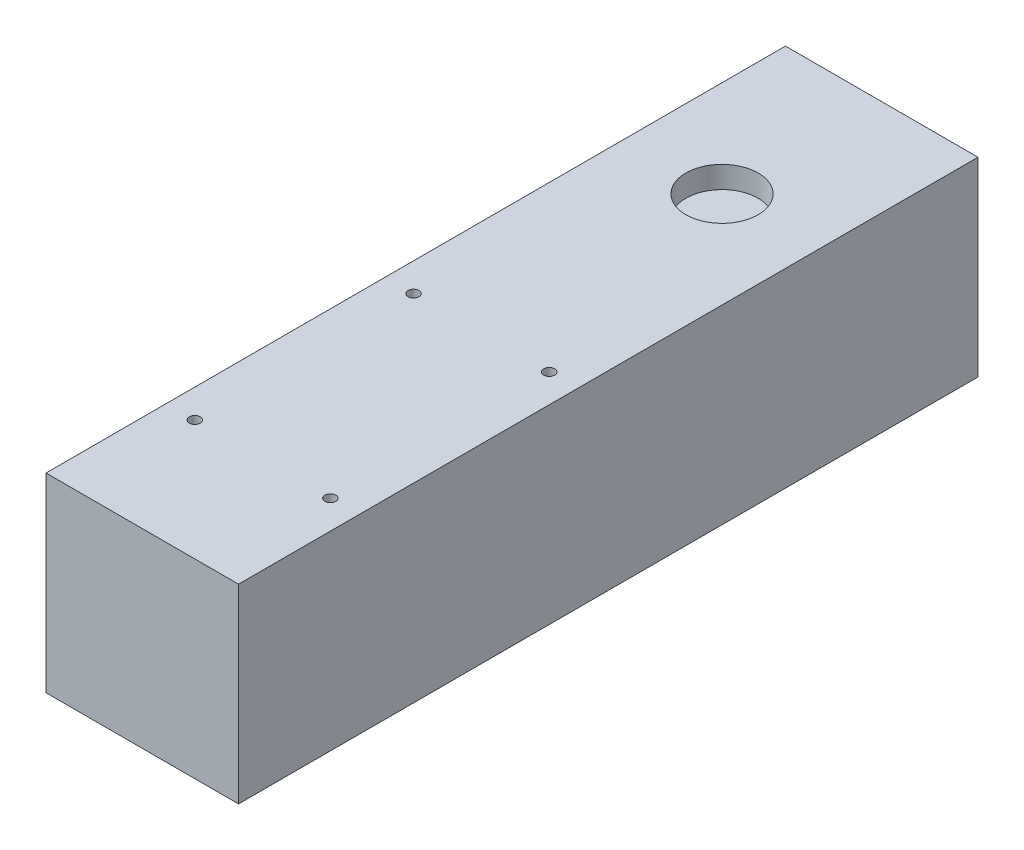
ISO-10303-21;
HEADER;
FILE_DESCRIPTION(('STEP AP214'),'2;1');
FILE_NAME('part.step','',(''),(''),'','','');
FILE_SCHEMA(('AUTOMOTIVE_DESIGN { 1 0 10303 214 1 1 1 1 }'));
ENDSEC;
DATA;
#1=APPLICATION_CONTEXT('core data for automotive mechanical design processes');
#2=APPLICATION_PROTOCOL_DEFINITION('international standard','automotive_design',2000,#1);
#3=PRODUCT_CONTEXT('',#1,'mechanical');
#4=PRODUCT('Part','Part','',(#3));
#5=PRODUCT_RELATED_PRODUCT_CATEGORY('part','',(#4));
#6=PRODUCT_DEFINITION_FORMATION('','',#4);
#7=PRODUCT_DEFINITION_CONTEXT('part definition',#1,'design');
#8=PRODUCT_DEFINITION('design','',#6,#7);
#9=PRODUCT_DEFINITION_SHAPE('','',#8);
#10=(LENGTH_UNIT() NAMED_UNIT(*) SI_UNIT(.MILLI.,.METRE.));
#11=(NAMED_UNIT(*) PLANE_ANGLE_UNIT() SI_UNIT($,.RADIAN.));
#12=(NAMED_UNIT(*) SI_UNIT($,.STERADIAN.) SOLID_ANGLE_UNIT());
#13=UNCERTAINTY_MEASURE_WITH_UNIT(LENGTH_MEASURE(1.E-05),#10,'distance_accuracy_value','');
#14=(GEOMETRIC_REPRESENTATION_CONTEXT(3) GLOBAL_UNCERTAINTY_ASSIGNED_CONTEXT((#13)) GLOBAL_UNIT_ASSIGNED_CONTEXT((#10,
#11,#12)) REPRESENTATION_CONTEXT('',''));
#15=CARTESIAN_POINT('',(0.,0.,0.));
#16=DIRECTION('',(0.,0.,1.));
#17=DIRECTION('',(1.,0.,0.));
#18=AXIS2_PLACEMENT_3D('',#15,#16,#17);
#19=CARTESIAN_POINT('',(-31.,87.,14.));
#20=DIRECTION('',(0.,-1.,0.));
#21=DIRECTION('',(0.,0.,-1.));
#22=AXIS2_PLACEMENT_3D('',#19,#20,#21);
#23=CYLINDRICAL_SURFACE('',#22,2.5);
#24=CARTESIAN_POINT('',(-31.,87.,14.));
#25=DIRECTION('',(0.,-1.,0.));
#26=DIRECTION('',(0.,0.,-1.));
#27=AXIS2_PLACEMENT_3D('',#24,#25,#26);
#28=CIRCLE('',#27,2.5);
#29=CARTESIAN_POINT('',(-31.,87.,11.5));
#30=VERTEX_POINT('',#29);
#31=EDGE_CURVE('E42',#30,#30,#28,.T.);
#32=ORIENTED_EDGE('',*,*,#31,.F.);
#33=EDGE_LOOP('',(#32));
#34=FACE_BOUND('',#33,.T.);
#35=CARTESIAN_POINT('',(-31.,0.,14.));
#36=DIRECTION('',(0.,-1.,0.));
#37=DIRECTION('',(0.,0.,-1.));
#38=AXIS2_PLACEMENT_3D('',#35,#36,#37);
#39=CIRCLE('',#38,2.5);
#40=CARTESIAN_POINT('',(-31.,0.,11.5));
#41=VERTEX_POINT('',#40);
#42=EDGE_CURVE('E11',#41,#41,#39,.T.);
#43=ORIENTED_EDGE('',*,*,#42,.T.);
#44=EDGE_LOOP('',(#43));
#45=FACE_BOUND('',#44,.T.);
#46=ADVANCED_FACE('F34',(#34,#45),#23,.F.);
#47=CARTESIAN_POINT('',(-31.,87.,114.));
#48=DIRECTION('',(0.,-1.,0.));
#49=DIRECTION('',(0.,0.,-1.));
#50=AXIS2_PLACEMENT_3D('',#47,#48,#49);
#51=CYLINDRICAL_SURFACE('',#50,2.5);
#52=CARTESIAN_POINT('',(-31.,87.,114.));
#53=DIRECTION('',(0.,-1.,0.));
#54=DIRECTION('',(0.,0.,-1.));
#55=AXIS2_PLACEMENT_3D('',#52,#53,#54);
#56=CIRCLE('',#55,2.5);
#57=CARTESIAN_POINT('',(-31.,87.,111.5));
#58=VERTEX_POINT('',#57);
#59=EDGE_CURVE('E112',#58,#58,#56,.T.);
#60=ORIENTED_EDGE('',*,*,#59,.F.);
#61=EDGE_LOOP('',(#60));
#62=FACE_BOUND('',#61,.T.);
#63=CARTESIAN_POINT('',(-31.,0.,114.));
#64=DIRECTION('',(0.,-1.,0.));
#65=DIRECTION('',(0.,0.,-1.));
#66=AXIS2_PLACEMENT_3D('',#63,#64,#65);
#67=CIRCLE('',#66,2.5);
#68=CARTESIAN_POINT('',(-31.,0.,111.5));
#69=VERTEX_POINT('',#68);
#70=EDGE_CURVE('E115',#69,#69,#67,.T.);
#71=ORIENTED_EDGE('',*,*,#70,.T.);
#72=EDGE_LOOP('',(#71));
#73=FACE_BOUND('',#72,.T.);
#74=ADVANCED_FACE('F123',(#62,#73),#51,.F.);
#75=CARTESIAN_POINT('',(44.,87.,-169.));
#76=DIRECTION('',(-1.,0.,0.));
#77=DIRECTION('',(0.,0.,1.));
#78=AXIS2_PLACEMENT_3D('',#75,#76,#77);
#79=PLANE('',#78);
#80=DIRECTION('',(0.,0.,-1.));
#81=VECTOR('',#80,1.);
#82=CARTESIAN_POINT('',(44.,0.,-169.));
#83=LINE('',#82,#81);
#84=CARTESIAN_POINT('',(44.,0.,169.));
#85=VERTEX_POINT('',#84);
#86=CARTESIAN_POINT('',(44.,0.,-169.));
#87=VERTEX_POINT('',#86);
#88=EDGE_CURVE('E102',#85,#87,#83,.T.);
#89=ORIENTED_EDGE('',*,*,#88,.T.);
#90=DIRECTION('',(0.,-1.,0.));
#91=VECTOR('',#90,1.);
#92=CARTESIAN_POINT('',(44.,87.,-169.));
#93=LINE('',#92,#91);
#94=CARTESIAN_POINT('',(44.,87.,-169.));
#95=VERTEX_POINT('',#94);
#96=EDGE_CURVE('E93',#95,#87,#93,.T.);
#97=ORIENTED_EDGE('',*,*,#96,.F.);
#98=DIRECTION('',(0.,0.,-1.));
#99=VECTOR('',#98,1.);
#100=CARTESIAN_POINT('',(44.,87.,-169.));
#101=LINE('',#100,#99);
#102=CARTESIAN_POINT('',(44.,87.,169.));
#103=VERTEX_POINT('',#102);
#104=EDGE_CURVE('E87',#103,#95,#101,.T.);
#105=ORIENTED_EDGE('',*,*,#104,.F.);
#106=DIRECTION('',(0.,-1.,0.));
#107=VECTOR('',#106,1.);
#108=CARTESIAN_POINT('',(44.,87.,169.));
#109=LINE('',#108,#107);
#110=EDGE_CURVE('E98',#103,#85,#109,.T.);
#111=ORIENTED_EDGE('',*,*,#110,.T.);
#112=EDGE_LOOP('',(#89,#97,#105,#111));
#113=FACE_BOUND('',#112,.T.);
#114=ADVANCED_FACE('F150',(#113),#79,.F.);
#115=CARTESIAN_POINT('',(-44.,87.,-169.));
#116=DIRECTION('',(0.,0.,1.));
#117=DIRECTION('',(1.,0.,0.));
#118=AXIS2_PLACEMENT_3D('',#115,#116,#117);
#119=PLANE('',#118);
#120=DIRECTION('',(-1.,0.,0.));
#121=VECTOR('',#120,1.);
#122=CARTESIAN_POINT('',(-44.,0.,-169.));
#123=LINE('',#122,#121);
#124=CARTESIAN_POINT('',(-44.,0.,-169.));
#125=VERTEX_POINT('',#124);
#126=EDGE_CURVE('E92',#87,#125,#123,.T.);
#127=ORIENTED_EDGE('',*,*,#126,.T.);
#128=DIRECTION('',(0.,-1.,0.));
#129=VECTOR('',#128,1.);
#130=CARTESIAN_POINT('',(-44.,87.,-169.));
#131=LINE('',#130,#129);
#132=CARTESIAN_POINT('',(-44.,87.,-169.));
#133=VERTEX_POINT('',#132);
#134=EDGE_CURVE('E90',#133,#125,#131,.T.);
#135=ORIENTED_EDGE('',*,*,#134,.F.);
#136=DIRECTION('',(-1.,0.,0.));
#137=VECTOR('',#136,1.);
#138=CARTESIAN_POINT('',(-44.,87.,-169.));
#139=LINE('',#138,#137);
#140=EDGE_CURVE('E81',#95,#133,#139,.T.);
#141=ORIENTED_EDGE('',*,*,#140,.F.);
#142=ORIENTED_EDGE('',*,*,#96,.T.);
#143=EDGE_LOOP('',(#127,#135,#141,#142));
#144=FACE_BOUND('',#143,.T.);
#145=ADVANCED_FACE('F91',(#144),#119,.F.);
#146=CARTESIAN_POINT('',(-44.,87.,-169.));
#147=DIRECTION('',(1.,0.,0.));
#148=DIRECTION('',(0.,0.,-1.));
#149=AXIS2_PLACEMENT_3D('',#146,#147,#148);
#150=PLANE('',#149);
#151=DIRECTION('',(0.,0.,1.));
#152=VECTOR('',#151,1.);
#153=CARTESIAN_POINT('',(-44.,0.,-169.));
#154=LINE('',#153,#152);
#155=CARTESIAN_POINT('',(-44.,0.,169.));
#156=VERTEX_POINT('',#155);
#157=EDGE_CURVE('E67',#125,#156,#154,.T.);
#158=ORIENTED_EDGE('',*,*,#157,.T.);
#159=DIRECTION('',(0.,-1.,0.));
#160=VECTOR('',#159,1.);
#161=CARTESIAN_POINT('',(-44.,87.,169.));
#162=LINE('',#161,#160);
#163=CARTESIAN_POINT('',(-44.,87.,169.));
#164=VERTEX_POINT('',#163);
#165=EDGE_CURVE('E94',#164,#156,#162,.T.);
#166=ORIENTED_EDGE('',*,*,#165,.F.);
#167=DIRECTION('',(0.,0.,1.));
#168=VECTOR('',#167,1.);
#169=CARTESIAN_POINT('',(-44.,87.,-169.));
#170=LINE('',#169,#168);
#171=EDGE_CURVE('E85',#133,#164,#170,.T.);
#172=ORIENTED_EDGE('',*,*,#171,.F.);
#173=ORIENTED_EDGE('',*,*,#134,.T.);
#174=EDGE_LOOP('',(#158,#166,#172,#173));
#175=FACE_BOUND('',#174,.T.);
#176=ADVANCED_FACE('F96',(#175),#150,.F.);
#177=CARTESIAN_POINT('',(-44.,87.,169.));
#178=DIRECTION('',(0.,0.,-1.));
#179=DIRECTION('',(-1.,0.,0.));
#180=AXIS2_PLACEMENT_3D('',#177,#178,#179);
#181=PLANE('',#180);
#182=DIRECTION('',(1.,0.,0.));
#183=VECTOR('',#182,1.);
#184=CARTESIAN_POINT('',(-44.,0.,169.));
#185=LINE('',#184,#183);
#186=EDGE_CURVE('E73',#156,#85,#185,.T.);
#187=ORIENTED_EDGE('',*,*,#186,.T.);
#188=ORIENTED_EDGE('',*,*,#110,.F.);
#189=DIRECTION('',(1.,0.,0.));
#190=VECTOR('',#189,1.);
#191=CARTESIAN_POINT('',(-44.,87.,169.));
#192=LINE('',#191,#190);
#193=EDGE_CURVE('E50',#164,#103,#192,.T.);
#194=ORIENTED_EDGE('',*,*,#193,.F.);
#195=ORIENTED_EDGE('',*,*,#165,.T.);
#196=EDGE_LOOP('',(#187,#188,#194,#195));
#197=FACE_BOUND('',#196,.T.);
#198=ADVANCED_FACE('F138',(#197),#181,.F.);
#199=CARTESIAN_POINT('',(0.,87.,0.));
#200=DIRECTION('',(0.,1.,0.));
#201=DIRECTION('',(0.,0.,1.));
#202=AXIS2_PLACEMENT_3D('',#199,#200,#201);
#203=PLANE('',#202);
#204=CARTESIAN_POINT('',(0.,87.,-96.));
#205=DIRECTION('',(0.,1.,0.));
#206=DIRECTION('',(0.,0.,1.));
#207=AXIS2_PLACEMENT_3D('',#204,#205,#206);
#208=CIRCLE('',#207,16.5242506023873);
#209=CARTESIAN_POINT('',(0.,87.,-79.4757493976127));
#210=VERTEX_POINT('',#209);
#211=EDGE_CURVE('E238',#210,#210,#208,.T.);
#212=ORIENTED_EDGE('',*,*,#211,.F.);
#213=EDGE_LOOP('',(#212));
#214=FACE_BOUND('',#213,.T.);
#215=CARTESIAN_POINT('',(31.,87.,14.));
#216=DIRECTION('',(0.,-1.,0.));
#217=DIRECTION('',(0.,0.,-1.));
#218=AXIS2_PLACEMENT_3D('',#215,#216,#217);
#219=CIRCLE('',#218,2.5);
#220=CARTESIAN_POINT('',(31.,87.,11.5));
#221=VERTEX_POINT('',#220);
#222=EDGE_CURVE('E220',#221,#221,#219,.T.);
#223=ORIENTED_EDGE('',*,*,#222,.T.);
#224=EDGE_LOOP('',(#223));
#225=FACE_BOUND('',#224,.T.);
#226=CARTESIAN_POINT('',(31.,87.,114.));
#227=DIRECTION('',(0.,-1.,0.));
#228=DIRECTION('',(0.,0.,-1.));
#229=AXIS2_PLACEMENT_3D('',#226,#227,#228);
#230=CIRCLE('',#229,2.5);
#231=CARTESIAN_POINT('',(31.,87.,111.5));
#232=VERTEX_POINT('',#231);
#233=EDGE_CURVE('E105',#232,#232,#230,.T.);
#234=ORIENTED_EDGE('',*,*,#233,.T.);
#235=EDGE_LOOP('',(#234));
#236=FACE_BOUND('',#235,.T.);
#237=ORIENTED_EDGE('',*,*,#104,.T.);
#238=ORIENTED_EDGE('',*,*,#140,.T.);
#239=ORIENTED_EDGE('',*,*,#171,.T.);
#240=ORIENTED_EDGE('',*,*,#193,.T.);
#241=EDGE_LOOP('',(#237,#238,#239,#240));
#242=FACE_BOUND('',#241,.T.);
#243=ORIENTED_EDGE('',*,*,#59,.T.);
#244=EDGE_LOOP('',(#243));
#245=FACE_BOUND('',#244,.T.);
#246=ORIENTED_EDGE('',*,*,#31,.T.);
#247=EDGE_LOOP('',(#246));
#248=FACE_BOUND('',#247,.T.);
#249=ADVANCED_FACE('F82',(#214,#225,#236,#242,#245,#248),#203,.T.);
#250=CARTESIAN_POINT('',(0.,0.,0.));
#251=DIRECTION('',(0.,1.,0.));
#252=DIRECTION('',(0.,0.,1.));
#253=AXIS2_PLACEMENT_3D('',#250,#251,#252);
#254=PLANE('',#253);
#255=CARTESIAN_POINT('',(31.,0.,14.));
#256=DIRECTION('',(0.,-1.,0.));
#257=DIRECTION('',(0.,0.,-1.));
#258=AXIS2_PLACEMENT_3D('',#255,#256,#257);
#259=CIRCLE('',#258,2.5);
#260=CARTESIAN_POINT('',(31.,0.,11.5));
#261=VERTEX_POINT('',#260);
#262=EDGE_CURVE('E222',#261,#261,#259,.T.);
#263=ORIENTED_EDGE('',*,*,#262,.F.);
#264=EDGE_LOOP('',(#263));
#265=FACE_BOUND('',#264,.T.);
#266=CARTESIAN_POINT('',(31.,0.,114.));
#267=DIRECTION('',(0.,-1.,0.));
#268=DIRECTION('',(0.,0.,-1.));
#269=AXIS2_PLACEMENT_3D('',#266,#267,#268);
#270=CIRCLE('',#269,2.5);
#271=CARTESIAN_POINT('',(31.,0.,111.5));
#272=VERTEX_POINT('',#271);
#273=EDGE_CURVE('E223',#272,#272,#270,.T.);
#274=ORIENTED_EDGE('',*,*,#273,.F.);
#275=EDGE_LOOP('',(#274));
#276=FACE_BOUND('',#275,.T.);
#277=ORIENTED_EDGE('',*,*,#88,.F.);
#278=ORIENTED_EDGE('',*,*,#186,.F.);
#279=ORIENTED_EDGE('',*,*,#157,.F.);
#280=ORIENTED_EDGE('',*,*,#126,.F.);
#281=EDGE_LOOP('',(#277,#278,#279,#280));
#282=FACE_BOUND('',#281,.T.);
#283=ORIENTED_EDGE('',*,*,#70,.F.);
#284=EDGE_LOOP('',(#283));
#285=FACE_BOUND('',#284,.T.);
#286=ORIENTED_EDGE('',*,*,#42,.F.);
#287=EDGE_LOOP('',(#286));
#288=FACE_BOUND('',#287,.T.);
#289=ADVANCED_FACE('F126',(#265,#276,#282,#285,#288),#254,.F.);
#290=CARTESIAN_POINT('',(31.,87.,114.));
#291=DIRECTION('',(0.,-1.,0.));
#292=DIRECTION('',(0.,0.,-1.));
#293=AXIS2_PLACEMENT_3D('',#290,#291,#292);
#294=CYLINDRICAL_SURFACE('',#293,2.5);
#295=ORIENTED_EDGE('',*,*,#233,.F.);
#296=EDGE_LOOP('',(#295));
#297=FACE_BOUND('',#296,.T.);
#298=ORIENTED_EDGE('',*,*,#273,.T.);
#299=EDGE_LOOP('',(#298));
#300=FACE_BOUND('',#299,.T.);
#301=ADVANCED_FACE('F128',(#297,#300),#294,.F.);
#302=CARTESIAN_POINT('',(31.,87.,14.));
#303=DIRECTION('',(0.,-1.,0.));
#304=DIRECTION('',(0.,0.,-1.));
#305=AXIS2_PLACEMENT_3D('',#302,#303,#304);
#306=CYLINDRICAL_SURFACE('',#305,2.5);
#307=ORIENTED_EDGE('',*,*,#222,.F.);
#308=EDGE_LOOP('',(#307));
#309=FACE_BOUND('',#308,.T.);
#310=ORIENTED_EDGE('',*,*,#262,.T.);
#311=EDGE_LOOP('',(#310));
#312=FACE_BOUND('',#311,.T.);
#313=ADVANCED_FACE('F135',(#309,#312),#306,.F.);
#314=CARTESIAN_POINT('',(0.,77.,-96.));
#315=DIRECTION('',(0.,1.,0.));
#316=DIRECTION('',(0.,0.,1.));
#317=AXIS2_PLACEMENT_3D('',#314,#315,#316);
#318=CYLINDRICAL_SURFACE('',#317,16.5242506023873);
#319=CARTESIAN_POINT('',(0.,77.,-96.));
#320=DIRECTION('',(0.,1.,0.));
#321=DIRECTION('',(0.,0.,1.));
#322=AXIS2_PLACEMENT_3D('',#319,#320,#321);
#323=CIRCLE('',#322,16.5242506023873);
#324=CARTESIAN_POINT('',(0.,77.,-79.4757493976127));
#325=VERTEX_POINT('',#324);
#326=EDGE_CURVE('E227',#325,#325,#323,.T.);
#327=ORIENTED_EDGE('',*,*,#326,.F.);
#328=EDGE_LOOP('',(#327));
#329=FACE_BOUND('',#328,.T.);
#330=ORIENTED_EDGE('',*,*,#211,.T.);
#331=EDGE_LOOP('',(#330));
#332=FACE_BOUND('',#331,.T.);
#333=ADVANCED_FACE('F194',(#329,#332),#318,.F.);
#334=CARTESIAN_POINT('',(0.,77.,-96.));
#335=DIRECTION('',(0.,1.,0.));
#336=DIRECTION('',(0.,0.,1.));
#337=AXIS2_PLACEMENT_3D('',#334,#335,#336);
#338=PLANE('',#337);
#339=ORIENTED_EDGE('',*,*,#326,.T.);
#340=EDGE_LOOP('',(#339));
#341=FACE_BOUND('',#340,.T.);
#342=ADVANCED_FACE('F199',(#341),#338,.T.);
#343=CLOSED_SHELL('',(#46,#74,#114,#145,#176,#198,#249,#289,#301,#313,#333,#342));
#344=MANIFOLD_SOLID_BREP('B2',#343);
#345=ADVANCED_BREP_SHAPE_REPRESENTATION('',(#18,#344),#14);
#346=SHAPE_DEFINITION_REPRESENTATION(#9,#345);
ENDSEC;
END-ISO-10303-21;
